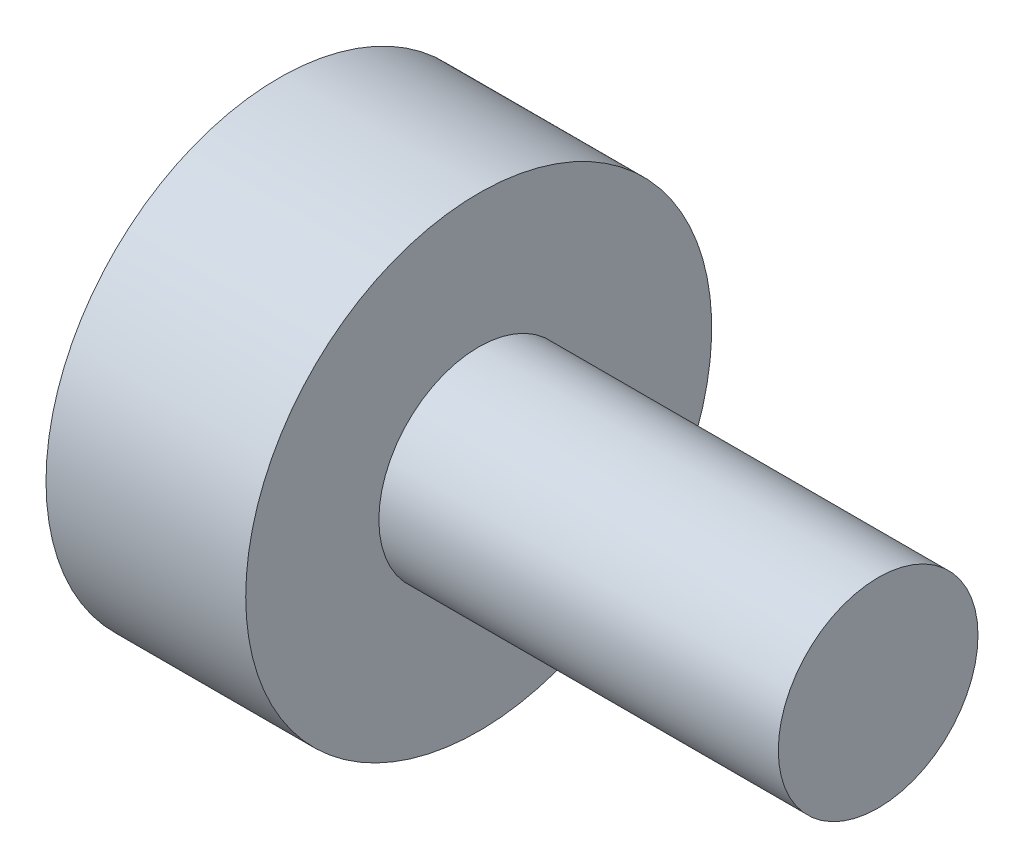
ISO-10303-21;
HEADER;
FILE_DESCRIPTION(('STEP AP214'),'2;1');
FILE_NAME('part.step','',(''),(''),'','','');
FILE_SCHEMA(('AUTOMOTIVE_DESIGN { 1 0 10303 214 1 1 1 1 }'));
ENDSEC;
DATA;
#1=APPLICATION_CONTEXT('core data for automotive mechanical design processes');
#2=APPLICATION_PROTOCOL_DEFINITION('international standard','automotive_design',2000,#1);
#3=PRODUCT_CONTEXT('',#1,'mechanical');
#4=PRODUCT('Part','Part','',(#3));
#5=PRODUCT_RELATED_PRODUCT_CATEGORY('part','',(#4));
#6=PRODUCT_DEFINITION_FORMATION('','',#4);
#7=PRODUCT_DEFINITION_CONTEXT('part definition',#1,'design');
#8=PRODUCT_DEFINITION('design','',#6,#7);
#9=PRODUCT_DEFINITION_SHAPE('','',#8);
#10=(LENGTH_UNIT() NAMED_UNIT(*) SI_UNIT(.MILLI.,.METRE.));
#11=(NAMED_UNIT(*) PLANE_ANGLE_UNIT() SI_UNIT($,.RADIAN.));
#12=(NAMED_UNIT(*) SI_UNIT($,.STERADIAN.) SOLID_ANGLE_UNIT());
#13=UNCERTAINTY_MEASURE_WITH_UNIT(LENGTH_MEASURE(1.E-05),#10,'distance_accuracy_value','');
#14=(GEOMETRIC_REPRESENTATION_CONTEXT(3) GLOBAL_UNCERTAINTY_ASSIGNED_CONTEXT((#13)) GLOBAL_UNIT_ASSIGNED_CONTEXT((#10,
#11,#12)) REPRESENTATION_CONTEXT('',''));
#15=CARTESIAN_POINT('',(0.,0.,0.));
#16=DIRECTION('',(0.,0.,1.));
#17=DIRECTION('',(1.,0.,0.));
#18=AXIS2_PLACEMENT_3D('',#15,#16,#17);
#19=CARTESIAN_POINT('',(0.,0.,0.));
#20=DIRECTION('',(1.,0.,0.));
#21=DIRECTION('',(0.,0.,-1.));
#22=AXIS2_PLACEMENT_3D('',#19,#20,#21);
#23=PLANE('',#22);
#24=CARTESIAN_POINT('',(0.,0.,0.));
#25=DIRECTION('',(1.,0.,0.));
#26=DIRECTION('',(0.,0.,-1.));
#27=AXIS2_PLACEMENT_3D('',#24,#25,#26);
#28=CIRCLE('',#27,9.);
#29=CARTESIAN_POINT('',(0.,0.,-9.));
#30=VERTEX_POINT('',#29);
#31=EDGE_CURVE('E65',#30,#30,#28,.T.);
#32=ORIENTED_EDGE('',*,*,#31,.T.);
#33=EDGE_LOOP('',(#32));
#34=FACE_BOUND('',#33,.T.);
#35=CARTESIAN_POINT('',(0.,0.,0.));
#36=DIRECTION('',(-1.,0.,0.));
#37=DIRECTION('',(0.,0.,1.));
#38=AXIS2_PLACEMENT_3D('',#35,#36,#37);
#39=CIRCLE('',#38,20.);
#40=CARTESIAN_POINT('',(0.,0.,20.));
#41=VERTEX_POINT('',#40);
#42=EDGE_CURVE('E10',#41,#41,#39,.T.);
#43=ORIENTED_EDGE('',*,*,#42,.T.);
#44=EDGE_LOOP('',(#43));
#45=FACE_BOUND('',#44,.T.);
#46=ADVANCED_FACE('F37',(#34,#45),#23,.F.);
#47=CARTESIAN_POINT('',(0.,0.,0.));
#48=DIRECTION('',(-1.,0.,0.));
#49=DIRECTION('',(0.,0.,1.));
#50=AXIS2_PLACEMENT_3D('',#47,#48,#49);
#51=CYLINDRICAL_SURFACE('',#50,20.);
#52=ORIENTED_EDGE('',*,*,#42,.F.);
#53=EDGE_LOOP('',(#52));
#54=FACE_BOUND('',#53,.T.);
#55=CARTESIAN_POINT('',(10.,0.,0.));
#56=DIRECTION('',(-1.,0.,0.));
#57=DIRECTION('',(0.,0.,1.));
#58=AXIS2_PLACEMENT_3D('',#55,#56,#57);
#59=CIRCLE('',#58,20.);
#60=CARTESIAN_POINT('',(10.,0.,20.));
#61=VERTEX_POINT('',#60);
#62=EDGE_CURVE('E44',#61,#61,#59,.T.);
#63=ORIENTED_EDGE('',*,*,#62,.T.);
#64=EDGE_LOOP('',(#63));
#65=FACE_BOUND('',#64,.T.);
#66=ADVANCED_FACE('F95',(#54,#65),#51,.T.);
#67=CARTESIAN_POINT('',(10.,20.,0.));
#68=DIRECTION('',(1.,0.,0.));
#69=DIRECTION('',(0.,0.,-1.));
#70=AXIS2_PLACEMENT_3D('',#67,#68,#69);
#71=PLANE('',#70);
#72=ORIENTED_EDGE('',*,*,#62,.F.);
#73=EDGE_LOOP('',(#72));
#74=FACE_BOUND('',#73,.T.);
#75=CARTESIAN_POINT('',(10.,0.,0.));
#76=DIRECTION('',(-1.,0.,0.));
#77=DIRECTION('',(0.,0.,1.));
#78=AXIS2_PLACEMENT_3D('',#75,#76,#77);
#79=CIRCLE('',#78,35.);
#80=CARTESIAN_POINT('',(10.,0.,35.));
#81=VERTEX_POINT('',#80);
#82=EDGE_CURVE('E48',#81,#81,#79,.T.);
#83=ORIENTED_EDGE('',*,*,#82,.T.);
#84=EDGE_LOOP('',(#83));
#85=FACE_BOUND('',#84,.T.);
#86=ADVANCED_FACE('F101',(#74,#85),#71,.F.);
#87=CARTESIAN_POINT('',(0.,0.,0.));
#88=DIRECTION('',(-1.,0.,0.));
#89=DIRECTION('',(0.,0.,1.));
#90=AXIS2_PLACEMENT_3D('',#87,#88,#89);
#91=CYLINDRICAL_SURFACE('',#90,35.);
#92=ORIENTED_EDGE('',*,*,#82,.F.);
#93=EDGE_LOOP('',(#92));
#94=FACE_BOUND('',#93,.T.);
#95=CARTESIAN_POINT('',(40.,0.,0.));
#96=DIRECTION('',(-1.,0.,0.));
#97=DIRECTION('',(0.,0.,1.));
#98=AXIS2_PLACEMENT_3D('',#95,#96,#97);
#99=CIRCLE('',#98,35.);
#100=CARTESIAN_POINT('',(40.,0.,35.));
#101=VERTEX_POINT('',#100);
#102=EDGE_CURVE('E53',#101,#101,#99,.T.);
#103=ORIENTED_EDGE('',*,*,#102,.T.);
#104=EDGE_LOOP('',(#103));
#105=FACE_BOUND('',#104,.T.);
#106=ADVANCED_FACE('F121',(#94,#105),#91,.T.);
#107=CARTESIAN_POINT('',(40.,35.,0.));
#108=DIRECTION('',(-1.,0.,0.));
#109=DIRECTION('',(0.,0.,1.));
#110=AXIS2_PLACEMENT_3D('',#107,#108,#109);
#111=PLANE('',#110);
#112=ORIENTED_EDGE('',*,*,#102,.F.);
#113=EDGE_LOOP('',(#112));
#114=FACE_BOUND('',#113,.T.);
#115=CARTESIAN_POINT('',(40.,0.,0.));
#116=DIRECTION('',(-1.,0.,0.));
#117=DIRECTION('',(0.,0.,1.));
#118=AXIS2_PLACEMENT_3D('',#115,#116,#117);
#119=CIRCLE('',#118,15.);
#120=CARTESIAN_POINT('',(40.,0.,15.));
#121=VERTEX_POINT('',#120);
#122=EDGE_CURVE('E56',#121,#121,#119,.T.);
#123=ORIENTED_EDGE('',*,*,#122,.T.);
#124=EDGE_LOOP('',(#123));
#125=FACE_BOUND('',#124,.T.);
#126=ADVANCED_FACE('F114',(#114,#125),#111,.F.);
#127=CARTESIAN_POINT('',(0.,0.,0.));
#128=DIRECTION('',(-1.,0.,0.));
#129=DIRECTION('',(0.,0.,1.));
#130=AXIS2_PLACEMENT_3D('',#127,#128,#129);
#131=CYLINDRICAL_SURFACE('',#130,15.);
#132=ORIENTED_EDGE('',*,*,#122,.F.);
#133=EDGE_LOOP('',(#132));
#134=FACE_BOUND('',#133,.T.);
#135=CARTESIAN_POINT('',(100.,0.,0.));
#136=DIRECTION('',(-1.,0.,0.));
#137=DIRECTION('',(0.,0.,1.));
#138=AXIS2_PLACEMENT_3D('',#135,#136,#137);
#139=CIRCLE('',#138,15.);
#140=CARTESIAN_POINT('',(100.,0.,15.));
#141=VERTEX_POINT('',#140);
#142=EDGE_CURVE('E59',#141,#141,#139,.T.);
#143=ORIENTED_EDGE('',*,*,#142,.T.);
#144=EDGE_LOOP('',(#143));
#145=FACE_BOUND('',#144,.T.);
#146=ADVANCED_FACE('F108',(#134,#145),#131,.T.);
#147=CARTESIAN_POINT('',(100.,0.,0.));
#148=DIRECTION('',(-1.,0.,0.));
#149=DIRECTION('',(0.,0.,1.));
#150=AXIS2_PLACEMENT_3D('',#147,#148,#149);
#151=PLANE('',#150);
#152=ORIENTED_EDGE('',*,*,#142,.F.);
#153=EDGE_LOOP('',(#152));
#154=FACE_BOUND('',#153,.T.);
#155=ADVANCED_FACE('F105',(#154),#151,.F.);
#156=CARTESIAN_POINT('',(5.,0.,0.));
#157=DIRECTION('',(-1.,0.,0.));
#158=DIRECTION('',(0.,0.,1.));
#159=AXIS2_PLACEMENT_3D('',#156,#157,#158);
#160=CYLINDRICAL_SURFACE('',#159,9.);
#161=CARTESIAN_POINT('',(5.,0.,0.));
#162=DIRECTION('',(1.,0.,0.));
#163=DIRECTION('',(0.,0.,-1.));
#164=AXIS2_PLACEMENT_3D('',#161,#162,#163);
#165=CIRCLE('',#164,9.);
#166=CARTESIAN_POINT('',(5.,0.,-9.));
#167=VERTEX_POINT('',#166);
#168=EDGE_CURVE('E68',#167,#167,#165,.T.);
#169=ORIENTED_EDGE('',*,*,#168,.T.);
#170=EDGE_LOOP('',(#169));
#171=FACE_BOUND('',#170,.T.);
#172=ORIENTED_EDGE('',*,*,#31,.F.);
#173=EDGE_LOOP('',(#172));
#174=FACE_BOUND('',#173,.T.);
#175=ADVANCED_FACE('F92',(#171,#174),#160,.F.);
#176=CARTESIAN_POINT('',(5.,0.,0.));
#177=DIRECTION('',(1.,0.,0.));
#178=DIRECTION('',(0.,0.,-1.));
#179=AXIS2_PLACEMENT_3D('',#176,#177,#178);
#180=PLANE('',#179);
#181=CARTESIAN_POINT('',(5.,0.,0.));
#182=DIRECTION('',(1.,0.,0.));
#183=DIRECTION('',(0.,0.,-1.));
#184=AXIS2_PLACEMENT_3D('',#181,#182,#183);
#185=CIRCLE('',#184,5.);
#186=CARTESIAN_POINT('',(5.,0.,-5.));
#187=VERTEX_POINT('',#186);
#188=EDGE_CURVE('E40',#187,#187,#185,.T.);
#189=ORIENTED_EDGE('',*,*,#188,.T.);
#190=EDGE_LOOP('',(#189));
#191=FACE_BOUND('',#190,.T.);
#192=ORIENTED_EDGE('',*,*,#168,.F.);
#193=EDGE_LOOP('',(#192));
#194=FACE_BOUND('',#193,.T.);
#195=ADVANCED_FACE('F75',(#191,#194),#180,.F.);
#196=CARTESIAN_POINT('',(20.,0.,0.));
#197=DIRECTION('',(1.,0.,0.));
#198=DIRECTION('',(0.,0.,-1.));
#199=AXIS2_PLACEMENT_3D('',#196,#197,#198);
#200=PLANE('',#199);
#201=CARTESIAN_POINT('',(20.,0.,0.));
#202=DIRECTION('',(1.,0.,0.));
#203=DIRECTION('',(0.,0.,-1.));
#204=AXIS2_PLACEMENT_3D('',#201,#202,#203);
#205=CIRCLE('',#204,5.);
#206=CARTESIAN_POINT('',(20.,0.,-5.));
#207=VERTEX_POINT('',#206);
#208=EDGE_CURVE('E62',#207,#207,#205,.T.);
#209=ORIENTED_EDGE('',*,*,#208,.F.);
#210=EDGE_LOOP('',(#209));
#211=FACE_BOUND('',#210,.T.);
#212=ADVANCED_FACE('F81',(#211),#200,.F.);
#213=CARTESIAN_POINT('',(20.,0.,0.));
#214=DIRECTION('',(-1.,0.,0.));
#215=DIRECTION('',(0.,0.,1.));
#216=AXIS2_PLACEMENT_3D('',#213,#214,#215);
#217=CYLINDRICAL_SURFACE('',#216,5.);
#218=ORIENTED_EDGE('',*,*,#188,.F.);
#219=EDGE_LOOP('',(#218));
#220=FACE_BOUND('',#219,.T.);
#221=ORIENTED_EDGE('',*,*,#208,.T.);
#222=EDGE_LOOP('',(#221));
#223=FACE_BOUND('',#222,.T.);
#224=ADVANCED_FACE('F78',(#220,#223),#217,.F.);
#225=CLOSED_SHELL('',(#46,#66,#86,#106,#126,#146,#155,#175,#195,#212,#224));
#226=MANIFOLD_SOLID_BREP('B2',#225);
#227=ADVANCED_BREP_SHAPE_REPRESENTATION('',(#18,#226),#14);
#228=SHAPE_DEFINITION_REPRESENTATION(#9,#227);
ENDSEC;
END-ISO-10303-21;
